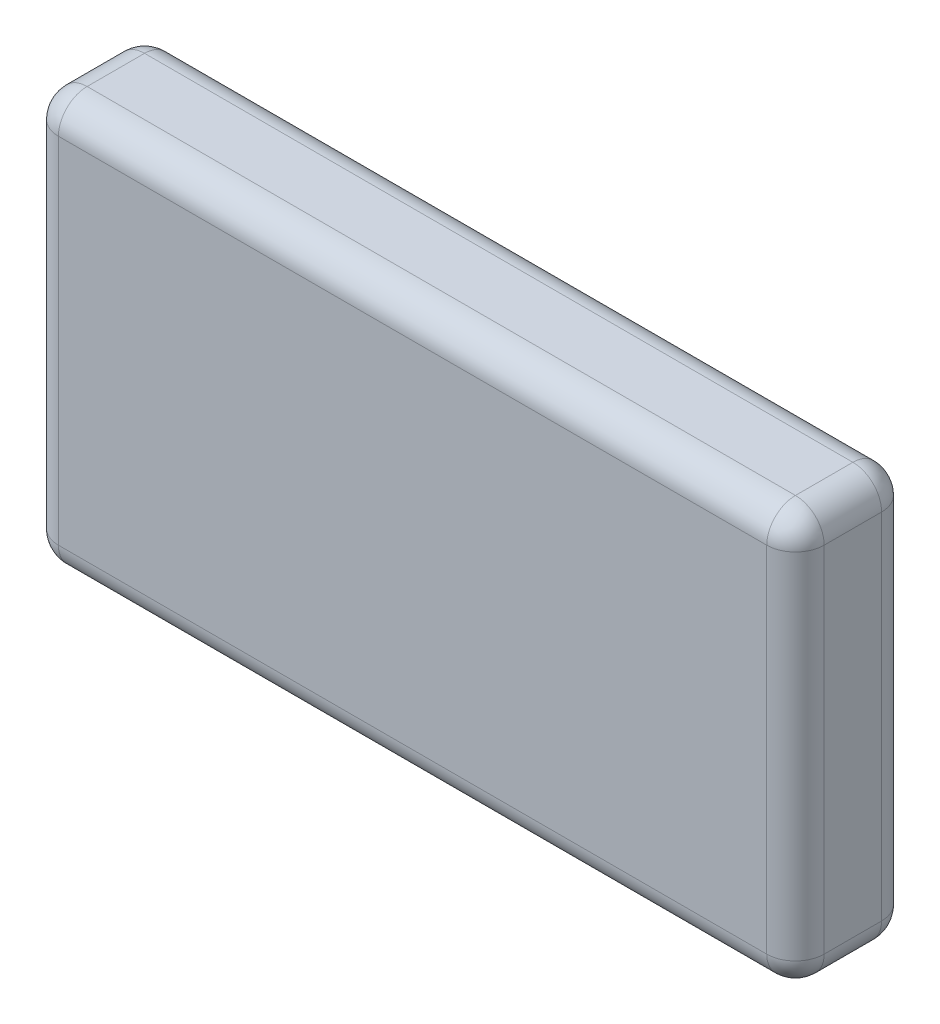
ISO-10303-21;
HEADER;
FILE_DESCRIPTION(('STEP AP214'),'2;1');
FILE_NAME('part.step','',(''),(''),'','','');
FILE_SCHEMA(('AUTOMOTIVE_DESIGN { 1 0 10303 214 1 1 1 1 }'));
ENDSEC;
DATA;
#1=APPLICATION_CONTEXT('core data for automotive mechanical design processes');
#2=APPLICATION_PROTOCOL_DEFINITION('international standard','automotive_design',2000,#1);
#3=PRODUCT_CONTEXT('',#1,'mechanical');
#4=PRODUCT('Part','Part','',(#3));
#5=PRODUCT_RELATED_PRODUCT_CATEGORY('part','',(#4));
#6=PRODUCT_DEFINITION_FORMATION('','',#4);
#7=PRODUCT_DEFINITION_CONTEXT('part definition',#1,'design');
#8=PRODUCT_DEFINITION('design','',#6,#7);
#9=PRODUCT_DEFINITION_SHAPE('','',#8);
#10=(LENGTH_UNIT() NAMED_UNIT(*) SI_UNIT(.MILLI.,.METRE.));
#11=(NAMED_UNIT(*) PLANE_ANGLE_UNIT() SI_UNIT($,.RADIAN.));
#12=(NAMED_UNIT(*) SI_UNIT($,.STERADIAN.) SOLID_ANGLE_UNIT());
#13=UNCERTAINTY_MEASURE_WITH_UNIT(LENGTH_MEASURE(1.E-05),#10,'distance_accuracy_value','');
#14=(GEOMETRIC_REPRESENTATION_CONTEXT(3) GLOBAL_UNCERTAINTY_ASSIGNED_CONTEXT((#13)) GLOBAL_UNIT_ASSIGNED_CONTEXT((#10,
#11,#12)) REPRESENTATION_CONTEXT('',''));
#15=CARTESIAN_POINT('',(0.,0.,0.));
#16=DIRECTION('',(0.,0.,1.));
#17=DIRECTION('',(1.,0.,0.));
#18=AXIS2_PLACEMENT_3D('',#15,#16,#17);
#19=CARTESIAN_POINT('',(-1000.,-537.5,300.));
#20=DIRECTION('',(1.,0.,0.));
#21=DIRECTION('',(0.,0.,-1.));
#22=AXIS2_PLACEMENT_3D('',#19,#20,#21);
#23=PLANE('',#22);
#24=DIRECTION('',(0.,-1.,0.));
#25=VECTOR('',#24,1.);
#26=CARTESIAN_POINT('',(-1000.,-537.5,75.));
#27=LINE('',#26,#25);
#28=CARTESIAN_POINT('',(-1000.,462.5,75.));
#29=VERTEX_POINT('',#28);
#30=CARTESIAN_POINT('',(-1000.,-462.5,75.));
#31=VERTEX_POINT('',#30);
#32=EDGE_CURVE('E159',#29,#31,#27,.T.);
#33=ORIENTED_EDGE('',*,*,#32,.T.);
#34=DIRECTION('',(0.,0.,-1.));
#35=VECTOR('',#34,1.);
#36=CARTESIAN_POINT('',(-1000.,-462.5,300.));
#37=LINE('',#36,#35);
#38=CARTESIAN_POINT('',(-1000.,-462.5,225.));
#39=VERTEX_POINT('',#38);
#40=EDGE_CURVE('E129',#31,#39,#37,.F.);
#41=ORIENTED_EDGE('',*,*,#40,.T.);
#42=DIRECTION('',(0.,-1.,0.));
#43=VECTOR('',#42,1.);
#44=CARTESIAN_POINT('',(-1000.,537.5,225.));
#45=LINE('',#44,#43);
#46=CARTESIAN_POINT('',(-1000.,462.5,225.));
#47=VERTEX_POINT('',#46);
#48=EDGE_CURVE('E165',#39,#47,#45,.F.);
#49=ORIENTED_EDGE('',*,*,#48,.T.);
#50=DIRECTION('',(0.,0.,-1.));
#51=VECTOR('',#50,1.);
#52=CARTESIAN_POINT('',(-1000.,462.5,300.));
#53=LINE('',#52,#51);
#54=EDGE_CURVE('E157',#47,#29,#53,.T.);
#55=ORIENTED_EDGE('',*,*,#54,.T.);
#56=EDGE_LOOP('',(#33,#41,#49,#55));
#57=FACE_BOUND('',#56,.T.);
#58=ADVANCED_FACE('F33',(#57),#23,.F.);
#59=CARTESIAN_POINT('',(1000.,-537.5,300.));
#60=DIRECTION('',(0.,1.,0.));
#61=DIRECTION('',(-1.,0.,0.));
#62=AXIS2_PLACEMENT_3D('',#59,#60,#61);
#63=PLANE('',#62);
#64=DIRECTION('',(1.,0.,0.));
#65=VECTOR('',#64,1.);
#66=CARTESIAN_POINT('',(-1000.,-537.5,225.));
#67=LINE('',#66,#65);
#68=CARTESIAN_POINT('',(925.,-537.5,225.));
#69=VERTEX_POINT('',#68);
#70=CARTESIAN_POINT('',(-925.,-537.5,225.));
#71=VERTEX_POINT('',#70);
#72=EDGE_CURVE('E155',#69,#71,#67,.F.);
#73=ORIENTED_EDGE('',*,*,#72,.T.);
#74=DIRECTION('',(0.,0.,-1.));
#75=VECTOR('',#74,1.);
#76=CARTESIAN_POINT('',(-925.,-537.5,300.));
#77=LINE('',#76,#75);
#78=CARTESIAN_POINT('',(-925.,-537.5,75.));
#79=VERTEX_POINT('',#78);
#80=EDGE_CURVE('E127',#71,#79,#77,.T.);
#81=ORIENTED_EDGE('',*,*,#80,.T.);
#82=DIRECTION('',(1.,0.,0.));
#83=VECTOR('',#82,1.);
#84=CARTESIAN_POINT('',(1000.,-537.5,75.));
#85=LINE('',#84,#83);
#86=CARTESIAN_POINT('',(925.,-537.5,75.));
#87=VERTEX_POINT('',#86);
#88=EDGE_CURVE('E145',#79,#87,#85,.T.);
#89=ORIENTED_EDGE('',*,*,#88,.T.);
#90=DIRECTION('',(0.,0.,-1.));
#91=VECTOR('',#90,1.);
#92=CARTESIAN_POINT('',(925.,-537.5,300.));
#93=LINE('',#92,#91);
#94=EDGE_CURVE('E151',#87,#69,#93,.F.);
#95=ORIENTED_EDGE('',*,*,#94,.T.);
#96=EDGE_LOOP('',(#73,#81,#89,#95));
#97=FACE_BOUND('',#96,.T.);
#98=ADVANCED_FACE('F153',(#97),#63,.F.);
#99=CARTESIAN_POINT('',(1000.,-537.5,300.));
#100=DIRECTION('',(-1.,0.,0.));
#101=DIRECTION('',(0.,0.,1.));
#102=AXIS2_PLACEMENT_3D('',#99,#100,#101);
#103=PLANE('',#102);
#104=DIRECTION('',(0.,1.,0.));
#105=VECTOR('',#104,1.);
#106=CARTESIAN_POINT('',(1000.,-537.5,225.));
#107=LINE('',#106,#105);
#108=CARTESIAN_POINT('',(1000.,462.5,225.));
#109=VERTEX_POINT('',#108);
#110=CARTESIAN_POINT('',(1000.,-462.5,225.));
#111=VERTEX_POINT('',#110);
#112=EDGE_CURVE('E177',#109,#111,#107,.F.);
#113=ORIENTED_EDGE('',*,*,#112,.T.);
#114=DIRECTION('',(0.,0.,-1.));
#115=VECTOR('',#114,1.);
#116=CARTESIAN_POINT('',(1000.,-462.5,300.));
#117=LINE('',#116,#115);
#118=CARTESIAN_POINT('',(1000.,-462.5,75.));
#119=VERTEX_POINT('',#118);
#120=EDGE_CURVE('E183',#111,#119,#117,.T.);
#121=ORIENTED_EDGE('',*,*,#120,.T.);
#122=DIRECTION('',(0.,1.,0.));
#123=VECTOR('',#122,1.);
#124=CARTESIAN_POINT('',(1000.,-537.5,75.));
#125=LINE('',#124,#123);
#126=CARTESIAN_POINT('',(1000.,462.5,75.));
#127=VERTEX_POINT('',#126);
#128=EDGE_CURVE('E181',#119,#127,#125,.T.);
#129=ORIENTED_EDGE('',*,*,#128,.T.);
#130=DIRECTION('',(0.,0.,-1.));
#131=VECTOR('',#130,1.);
#132=CARTESIAN_POINT('',(1000.,462.5,300.));
#133=LINE('',#132,#131);
#134=EDGE_CURVE('E179',#127,#109,#133,.F.);
#135=ORIENTED_EDGE('',*,*,#134,.T.);
#136=EDGE_LOOP('',(#113,#121,#129,#135));
#137=FACE_BOUND('',#136,.T.);
#138=ADVANCED_FACE('F281',(#137),#103,.F.);
#139=CARTESIAN_POINT('',(1000.,537.5,300.));
#140=DIRECTION('',(0.,-1.,0.));
#141=DIRECTION('',(1.,0.,0.));
#142=AXIS2_PLACEMENT_3D('',#139,#140,#141);
#143=PLANE('',#142);
#144=DIRECTION('',(-1.,0.,0.));
#145=VECTOR('',#144,1.);
#146=CARTESIAN_POINT('',(1000.,537.5,225.));
#147=LINE('',#146,#145);
#148=CARTESIAN_POINT('',(-925.,537.5,225.));
#149=VERTEX_POINT('',#148);
#150=CARTESIAN_POINT('',(925.,537.5,225.));
#151=VERTEX_POINT('',#150);
#152=EDGE_CURVE('E195',#149,#151,#147,.F.);
#153=ORIENTED_EDGE('',*,*,#152,.T.);
#154=DIRECTION('',(0.,0.,-1.));
#155=VECTOR('',#154,1.);
#156=CARTESIAN_POINT('',(925.,537.5,300.));
#157=LINE('',#156,#155);
#158=CARTESIAN_POINT('',(925.,537.5,75.));
#159=VERTEX_POINT('',#158);
#160=EDGE_CURVE('E11',#151,#159,#157,.T.);
#161=ORIENTED_EDGE('',*,*,#160,.T.);
#162=DIRECTION('',(-1.,0.,0.));
#163=VECTOR('',#162,1.);
#164=CARTESIAN_POINT('',(1000.,537.5,75.));
#165=LINE('',#164,#163);
#166=CARTESIAN_POINT('',(-925.,537.5,75.));
#167=VERTEX_POINT('',#166);
#168=EDGE_CURVE('E42',#159,#167,#165,.T.);
#169=ORIENTED_EDGE('',*,*,#168,.T.);
#170=DIRECTION('',(0.,0.,-1.));
#171=VECTOR('',#170,1.);
#172=CARTESIAN_POINT('',(-925.,537.5,300.));
#173=LINE('',#172,#171);
#174=EDGE_CURVE('E197',#167,#149,#173,.F.);
#175=ORIENTED_EDGE('',*,*,#174,.T.);
#176=EDGE_LOOP('',(#153,#161,#169,#175));
#177=FACE_BOUND('',#176,.T.);
#178=ADVANCED_FACE('F293',(#177),#143,.F.);
#179=CARTESIAN_POINT('',(0.,0.,300.));
#180=DIRECTION('',(0.,0.,1.));
#181=DIRECTION('',(1.,0.,0.));
#182=AXIS2_PLACEMENT_3D('',#179,#180,#181);
#183=PLANE('',#182);
#184=DIRECTION('',(0.,-1.,0.));
#185=VECTOR('',#184,1.);
#186=CARTESIAN_POINT('',(-925.,-537.5,300.));
#187=LINE('',#186,#185);
#188=CARTESIAN_POINT('',(-925.,462.5,300.));
#189=VERTEX_POINT('',#188);
#190=CARTESIAN_POINT('',(-925.,-462.5,300.));
#191=VERTEX_POINT('',#190);
#192=EDGE_CURVE('E172',#189,#191,#187,.T.);
#193=ORIENTED_EDGE('',*,*,#192,.T.);
#194=DIRECTION('',(1.,0.,0.));
#195=VECTOR('',#194,1.);
#196=CARTESIAN_POINT('',(1000.,-462.5,300.));
#197=LINE('',#196,#195);
#198=CARTESIAN_POINT('',(925.,-462.5,300.));
#199=VERTEX_POINT('',#198);
#200=EDGE_CURVE('E174',#191,#199,#197,.T.);
#201=ORIENTED_EDGE('',*,*,#200,.T.);
#202=DIRECTION('',(0.,1.,0.));
#203=VECTOR('',#202,1.);
#204=CARTESIAN_POINT('',(925.,537.5,300.));
#205=LINE('',#204,#203);
#206=CARTESIAN_POINT('',(925.,462.5,300.));
#207=VERTEX_POINT('',#206);
#208=EDGE_CURVE('E170',#199,#207,#205,.T.);
#209=ORIENTED_EDGE('',*,*,#208,.T.);
#210=DIRECTION('',(-1.,0.,0.));
#211=VECTOR('',#210,1.);
#212=CARTESIAN_POINT('',(-1000.,462.5,300.));
#213=LINE('',#212,#211);
#214=EDGE_CURVE('E168',#207,#189,#213,.T.);
#215=ORIENTED_EDGE('',*,*,#214,.T.);
#216=EDGE_LOOP('',(#193,#201,#209,#215));
#217=FACE_BOUND('',#216,.T.);
#218=ADVANCED_FACE('F272',(#217),#183,.T.);
#219=CARTESIAN_POINT('',(0.,0.,0.));
#220=DIRECTION('',(0.,0.,1.));
#221=DIRECTION('',(1.,0.,0.));
#222=AXIS2_PLACEMENT_3D('',#219,#220,#221);
#223=PLANE('',#222);
#224=DIRECTION('',(0.,1.,0.));
#225=VECTOR('',#224,1.);
#226=CARTESIAN_POINT('',(925.,0.,0.));
#227=LINE('',#226,#225);
#228=CARTESIAN_POINT('',(925.,462.5,0.));
#229=VERTEX_POINT('',#228);
#230=CARTESIAN_POINT('',(925.,-462.5,0.));
#231=VERTEX_POINT('',#230);
#232=EDGE_CURVE('E188',#229,#231,#227,.F.);
#233=ORIENTED_EDGE('',*,*,#232,.T.);
#234=DIRECTION('',(1.,0.,0.));
#235=VECTOR('',#234,1.);
#236=CARTESIAN_POINT('',(0.,-462.5,0.));
#237=LINE('',#236,#235);
#238=CARTESIAN_POINT('',(-925.,-462.5,0.));
#239=VERTEX_POINT('',#238);
#240=EDGE_CURVE('E192',#231,#239,#237,.F.);
#241=ORIENTED_EDGE('',*,*,#240,.T.);
#242=DIRECTION('',(0.,-1.,0.));
#243=VECTOR('',#242,1.);
#244=CARTESIAN_POINT('',(-925.,0.,0.));
#245=LINE('',#244,#243);
#246=CARTESIAN_POINT('',(-925.,462.5,0.));
#247=VERTEX_POINT('',#246);
#248=EDGE_CURVE('E190',#239,#247,#245,.F.);
#249=ORIENTED_EDGE('',*,*,#248,.T.);
#250=DIRECTION('',(-1.,0.,0.));
#251=VECTOR('',#250,1.);
#252=CARTESIAN_POINT('',(0.,462.5,0.));
#253=LINE('',#252,#251);
#254=EDGE_CURVE('E186',#247,#229,#253,.F.);
#255=ORIENTED_EDGE('',*,*,#254,.T.);
#256=EDGE_LOOP('',(#233,#241,#249,#255));
#257=FACE_BOUND('',#256,.T.);
#258=ADVANCED_FACE('F477',(#257),#223,.F.);
#259=CARTESIAN_POINT('',(925.,462.5,300.));
#260=DIRECTION('',(0.,0.,-1.));
#261=DIRECTION('',(-1.,0.,0.));
#262=AXIS2_PLACEMENT_3D('',#259,#260,#261);
#263=CYLINDRICAL_SURFACE('',#262,75.);
#264=CARTESIAN_POINT('',(925.,462.5,225.));
#265=DIRECTION('',(0.,0.,1.));
#266=DIRECTION('',(1.,0.,0.));
#267=AXIS2_PLACEMENT_3D('',#264,#265,#266);
#268=CIRCLE('',#267,75.);
#269=EDGE_CURVE('E37',#109,#151,#268,.T.);
#270=ORIENTED_EDGE('',*,*,#269,.F.);
#271=ORIENTED_EDGE('',*,*,#134,.F.);
#272=CARTESIAN_POINT('',(925.,462.5,75.));
#273=DIRECTION('',(0.,0.,-1.));
#274=DIRECTION('',(-1.,0.,0.));
#275=AXIS2_PLACEMENT_3D('',#272,#273,#274);
#276=CIRCLE('',#275,75.);
#277=EDGE_CURVE('E249',#159,#127,#276,.T.);
#278=ORIENTED_EDGE('',*,*,#277,.F.);
#279=ORIENTED_EDGE('',*,*,#160,.F.);
#280=EDGE_LOOP('',(#270,#271,#278,#279));
#281=FACE_BOUND('',#280,.T.);
#282=ADVANCED_FACE('F35',(#281),#263,.T.);
#283=CARTESIAN_POINT('',(925.,462.5,225.));
#284=DIRECTION('',(0.,0.,1.));
#285=DIRECTION('',(1.,0.,0.));
#286=AXIS2_PLACEMENT_3D('',#283,#284,#285);
#287=SPHERICAL_SURFACE('',#286,75.);
#288=CARTESIAN_POINT('',(925.,462.5,225.));
#289=DIRECTION('',(0.,1.,0.));
#290=DIRECTION('',(0.,0.,1.));
#291=AXIS2_PLACEMENT_3D('',#288,#289,#290);
#292=CIRCLE('',#291,75.);
#293=EDGE_CURVE('E244',#109,#207,#292,.F.);
#294=ORIENTED_EDGE('',*,*,#293,.F.);
#295=ORIENTED_EDGE('',*,*,#269,.T.);
#296=CARTESIAN_POINT('',(925.,462.5,225.));
#297=DIRECTION('',(1.,0.,0.));
#298=DIRECTION('',(0.,0.,-1.));
#299=AXIS2_PLACEMENT_3D('',#296,#297,#298);
#300=CIRCLE('',#299,75.);
#301=EDGE_CURVE('E247',#207,#151,#300,.F.);
#302=ORIENTED_EDGE('',*,*,#301,.F.);
#303=EDGE_LOOP('',(#294,#295,#302));
#304=FACE_BOUND('',#303,.T.);
#305=ADVANCED_FACE('F259',(#304),#287,.T.);
#306=CARTESIAN_POINT('',(925.,462.5,75.));
#307=DIRECTION('',(0.,0.,1.));
#308=DIRECTION('',(1.,0.,0.));
#309=AXIS2_PLACEMENT_3D('',#306,#307,#308);
#310=SPHERICAL_SURFACE('',#309,75.);
#311=CARTESIAN_POINT('',(925.,462.5,75.));
#312=DIRECTION('',(1.,0.,0.));
#313=DIRECTION('',(0.,0.,-1.));
#314=AXIS2_PLACEMENT_3D('',#311,#312,#313);
#315=CIRCLE('',#314,75.);
#316=EDGE_CURVE('E239',#159,#229,#315,.F.);
#317=ORIENTED_EDGE('',*,*,#316,.F.);
#318=ORIENTED_EDGE('',*,*,#277,.T.);
#319=CARTESIAN_POINT('',(925.,462.5,75.));
#320=DIRECTION('',(0.,1.,0.));
#321=DIRECTION('',(0.,0.,1.));
#322=AXIS2_PLACEMENT_3D('',#319,#320,#321);
#323=CIRCLE('',#322,75.);
#324=EDGE_CURVE('E241',#229,#127,#323,.F.);
#325=ORIENTED_EDGE('',*,*,#324,.F.);
#326=EDGE_LOOP('',(#317,#318,#325));
#327=FACE_BOUND('',#326,.T.);
#328=ADVANCED_FACE('F456',(#327),#310,.T.);
#329=CARTESIAN_POINT('',(0.,462.5,225.));
#330=DIRECTION('',(1.,0.,0.));
#331=DIRECTION('',(0.,1.,0.));
#332=AXIS2_PLACEMENT_3D('',#329,#330,#331);
#333=CYLINDRICAL_SURFACE('',#332,75.);
#334=ORIENTED_EDGE('',*,*,#301,.T.);
#335=ORIENTED_EDGE('',*,*,#152,.F.);
#336=CARTESIAN_POINT('',(-925.,462.5,225.));
#337=DIRECTION('',(-1.,0.,0.));
#338=DIRECTION('',(0.,0.,1.));
#339=AXIS2_PLACEMENT_3D('',#336,#337,#338);
#340=CIRCLE('',#339,75.);
#341=EDGE_CURVE('E233',#189,#149,#340,.T.);
#342=ORIENTED_EDGE('',*,*,#341,.F.);
#343=ORIENTED_EDGE('',*,*,#214,.F.);
#344=EDGE_LOOP('',(#334,#335,#342,#343));
#345=FACE_BOUND('',#344,.T.);
#346=ADVANCED_FACE('F267',(#345),#333,.T.);
#347=CARTESIAN_POINT('',(925.,0.,225.));
#348=DIRECTION('',(0.,-1.,0.));
#349=DIRECTION('',(0.,0.,-1.));
#350=AXIS2_PLACEMENT_3D('',#347,#348,#349);
#351=CYLINDRICAL_SURFACE('',#350,75.);
#352=ORIENTED_EDGE('',*,*,#293,.T.);
#353=ORIENTED_EDGE('',*,*,#208,.F.);
#354=CARTESIAN_POINT('',(925.,-462.5,225.));
#355=DIRECTION('',(0.,-1.,0.));
#356=DIRECTION('',(0.,0.,-1.));
#357=AXIS2_PLACEMENT_3D('',#354,#355,#356);
#358=CIRCLE('',#357,75.);
#359=EDGE_CURVE('E230',#111,#199,#358,.T.);
#360=ORIENTED_EDGE('',*,*,#359,.F.);
#361=ORIENTED_EDGE('',*,*,#112,.F.);
#362=EDGE_LOOP('',(#352,#353,#360,#361));
#363=FACE_BOUND('',#362,.T.);
#364=ADVANCED_FACE('F278',(#363),#351,.T.);
#365=CARTESIAN_POINT('',(925.,-462.5,300.));
#366=DIRECTION('',(0.,0.,-1.));
#367=DIRECTION('',(-1.,0.,0.));
#368=AXIS2_PLACEMENT_3D('',#365,#366,#367);
#369=CYLINDRICAL_SURFACE('',#368,75.);
#370=CARTESIAN_POINT('',(925.,-462.5,75.));
#371=DIRECTION('',(0.,0.,-1.));
#372=DIRECTION('',(-1.,0.,0.));
#373=AXIS2_PLACEMENT_3D('',#370,#371,#372);
#374=CIRCLE('',#373,75.);
#375=EDGE_CURVE('E224',#119,#87,#374,.T.);
#376=ORIENTED_EDGE('',*,*,#375,.F.);
#377=ORIENTED_EDGE('',*,*,#120,.F.);
#378=CARTESIAN_POINT('',(925.,-462.5,225.));
#379=DIRECTION('',(0.,0.,1.));
#380=DIRECTION('',(1.,0.,0.));
#381=AXIS2_PLACEMENT_3D('',#378,#379,#380);
#382=CIRCLE('',#381,75.);
#383=EDGE_CURVE('E227',#69,#111,#382,.T.);
#384=ORIENTED_EDGE('',*,*,#383,.F.);
#385=ORIENTED_EDGE('',*,*,#94,.F.);
#386=EDGE_LOOP('',(#376,#377,#384,#385));
#387=FACE_BOUND('',#386,.T.);
#388=ADVANCED_FACE('F285',(#387),#369,.T.);
#389=CARTESIAN_POINT('',(925.,-537.5,75.));
#390=DIRECTION('',(0.,1.,0.));
#391=DIRECTION('',(0.,0.,1.));
#392=AXIS2_PLACEMENT_3D('',#389,#390,#391);
#393=CYLINDRICAL_SURFACE('',#392,75.);
#394=ORIENTED_EDGE('',*,*,#324,.T.);
#395=ORIENTED_EDGE('',*,*,#128,.F.);
#396=CARTESIAN_POINT('',(925.,-462.5,75.));
#397=DIRECTION('',(0.,-1.,0.));
#398=DIRECTION('',(0.,0.,-1.));
#399=AXIS2_PLACEMENT_3D('',#396,#397,#398);
#400=CIRCLE('',#399,75.);
#401=EDGE_CURVE('E222',#231,#119,#400,.T.);
#402=ORIENTED_EDGE('',*,*,#401,.F.);
#403=ORIENTED_EDGE('',*,*,#232,.F.);
#404=EDGE_LOOP('',(#394,#395,#402,#403));
#405=FACE_BOUND('',#404,.T.);
#406=ADVANCED_FACE('F291',(#405),#393,.T.);
#407=CARTESIAN_POINT('',(1000.,462.5,75.));
#408=DIRECTION('',(-1.,0.,0.));
#409=DIRECTION('',(0.,-1.,0.));
#410=AXIS2_PLACEMENT_3D('',#407,#408,#409);
#411=CYLINDRICAL_SURFACE('',#410,75.);
#412=ORIENTED_EDGE('',*,*,#316,.T.);
#413=ORIENTED_EDGE('',*,*,#254,.F.);
#414=CARTESIAN_POINT('',(-925.,462.5,75.));
#415=DIRECTION('',(-1.,0.,0.));
#416=DIRECTION('',(0.,0.,1.));
#417=AXIS2_PLACEMENT_3D('',#414,#415,#416);
#418=CIRCLE('',#417,75.);
#419=EDGE_CURVE('E219',#167,#247,#418,.T.);
#420=ORIENTED_EDGE('',*,*,#419,.F.);
#421=ORIENTED_EDGE('',*,*,#168,.F.);
#422=EDGE_LOOP('',(#412,#413,#420,#421));
#423=FACE_BOUND('',#422,.T.);
#424=ADVANCED_FACE('F300',(#423),#411,.T.);
#425=CARTESIAN_POINT('',(-925.,462.5,300.));
#426=DIRECTION('',(0.,0.,-1.));
#427=DIRECTION('',(-1.,0.,0.));
#428=AXIS2_PLACEMENT_3D('',#425,#426,#427);
#429=CYLINDRICAL_SURFACE('',#428,75.);
#430=CARTESIAN_POINT('',(-925.,462.5,225.));
#431=DIRECTION('',(0.,0.,1.));
#432=DIRECTION('',(1.,0.,0.));
#433=AXIS2_PLACEMENT_3D('',#430,#431,#432);
#434=CIRCLE('',#433,75.);
#435=EDGE_CURVE('E236',#149,#47,#434,.T.);
#436=ORIENTED_EDGE('',*,*,#435,.F.);
#437=ORIENTED_EDGE('',*,*,#174,.F.);
#438=CARTESIAN_POINT('',(-925.,462.5,75.));
#439=DIRECTION('',(0.,0.,-1.));
#440=DIRECTION('',(-1.,0.,0.));
#441=AXIS2_PLACEMENT_3D('',#438,#439,#440);
#442=CIRCLE('',#441,75.);
#443=EDGE_CURVE('E216',#29,#167,#442,.T.);
#444=ORIENTED_EDGE('',*,*,#443,.F.);
#445=ORIENTED_EDGE('',*,*,#54,.F.);
#446=EDGE_LOOP('',(#436,#437,#444,#445));
#447=FACE_BOUND('',#446,.T.);
#448=ADVANCED_FACE('F296',(#447),#429,.T.);
#449=CARTESIAN_POINT('',(-925.,462.5,225.));
#450=DIRECTION('',(0.,0.,1.));
#451=DIRECTION('',(1.,0.,0.));
#452=AXIS2_PLACEMENT_3D('',#449,#450,#451);
#453=SPHERICAL_SURFACE('',#452,75.);
#454=ORIENTED_EDGE('',*,*,#341,.T.);
#455=ORIENTED_EDGE('',*,*,#435,.T.);
#456=CARTESIAN_POINT('',(-925.,462.5,225.));
#457=DIRECTION('',(0.,1.,0.));
#458=DIRECTION('',(0.,0.,1.));
#459=AXIS2_PLACEMENT_3D('',#456,#457,#458);
#460=CIRCLE('',#459,75.);
#461=EDGE_CURVE('E213',#189,#47,#460,.F.);
#462=ORIENTED_EDGE('',*,*,#461,.F.);
#463=EDGE_LOOP('',(#454,#455,#462));
#464=FACE_BOUND('',#463,.T.);
#465=ADVANCED_FACE('F309',(#464),#453,.T.);
#466=CARTESIAN_POINT('',(925.,-462.5,225.));
#467=DIRECTION('',(0.,0.,1.));
#468=DIRECTION('',(1.,0.,0.));
#469=AXIS2_PLACEMENT_3D('',#466,#467,#468);
#470=SPHERICAL_SURFACE('',#469,75.);
#471=ORIENTED_EDGE('',*,*,#383,.T.);
#472=ORIENTED_EDGE('',*,*,#359,.T.);
#473=CARTESIAN_POINT('',(925.,-462.5,225.));
#474=DIRECTION('',(1.,0.,0.));
#475=DIRECTION('',(0.,0.,-1.));
#476=AXIS2_PLACEMENT_3D('',#473,#474,#475);
#477=CIRCLE('',#476,75.);
#478=EDGE_CURVE('E211',#69,#199,#477,.F.);
#479=ORIENTED_EDGE('',*,*,#478,.F.);
#480=EDGE_LOOP('',(#471,#472,#479));
#481=FACE_BOUND('',#480,.T.);
#482=ADVANCED_FACE('F319',(#481),#470,.T.);
#483=CARTESIAN_POINT('',(925.,-462.5,75.));
#484=DIRECTION('',(0.,0.,1.));
#485=DIRECTION('',(1.,0.,0.));
#486=AXIS2_PLACEMENT_3D('',#483,#484,#485);
#487=SPHERICAL_SURFACE('',#486,75.);
#488=ORIENTED_EDGE('',*,*,#401,.T.);
#489=ORIENTED_EDGE('',*,*,#375,.T.);
#490=CARTESIAN_POINT('',(925.,-462.5,75.));
#491=DIRECTION('',(1.,0.,0.));
#492=DIRECTION('',(0.,0.,-1.));
#493=AXIS2_PLACEMENT_3D('',#490,#491,#492);
#494=CIRCLE('',#493,75.);
#495=EDGE_CURVE('E148',#231,#87,#494,.F.);
#496=ORIENTED_EDGE('',*,*,#495,.F.);
#497=EDGE_LOOP('',(#488,#489,#496));
#498=FACE_BOUND('',#497,.T.);
#499=ADVANCED_FACE('F321',(#498),#487,.T.);
#500=CARTESIAN_POINT('',(-925.,462.5,75.));
#501=DIRECTION('',(0.,0.,1.));
#502=DIRECTION('',(1.,0.,0.));
#503=AXIS2_PLACEMENT_3D('',#500,#501,#502);
#504=SPHERICAL_SURFACE('',#503,75.);
#505=ORIENTED_EDGE('',*,*,#443,.T.);
#506=ORIENTED_EDGE('',*,*,#419,.T.);
#507=CARTESIAN_POINT('',(-925.,462.5,75.));
#508=DIRECTION('',(0.,1.,0.));
#509=DIRECTION('',(-1.,0.,0.));
#510=AXIS2_PLACEMENT_3D('',#507,#508,#509);
#511=CIRCLE('',#510,75.);
#512=EDGE_CURVE('E207',#29,#247,#511,.F.);
#513=ORIENTED_EDGE('',*,*,#512,.F.);
#514=EDGE_LOOP('',(#505,#506,#513));
#515=FACE_BOUND('',#514,.T.);
#516=ADVANCED_FACE('F302',(#515),#504,.T.);
#517=CARTESIAN_POINT('',(-925.,0.,225.));
#518=DIRECTION('',(0.,1.,0.));
#519=DIRECTION('',(0.,0.,1.));
#520=AXIS2_PLACEMENT_3D('',#517,#518,#519);
#521=CYLINDRICAL_SURFACE('',#520,75.);
#522=ORIENTED_EDGE('',*,*,#461,.T.);
#523=ORIENTED_EDGE('',*,*,#48,.F.);
#524=CARTESIAN_POINT('',(-925.,-462.5,225.));
#525=DIRECTION('',(0.,-1.,0.));
#526=DIRECTION('',(0.,0.,-1.));
#527=AXIS2_PLACEMENT_3D('',#524,#525,#526);
#528=CIRCLE('',#527,75.);
#529=EDGE_CURVE('E204',#191,#39,#528,.T.);
#530=ORIENTED_EDGE('',*,*,#529,.F.);
#531=ORIENTED_EDGE('',*,*,#192,.F.);
#532=EDGE_LOOP('',(#522,#523,#530,#531));
#533=FACE_BOUND('',#532,.T.);
#534=ADVANCED_FACE('F311',(#533),#521,.T.);
#535=CARTESIAN_POINT('',(0.,-462.5,225.));
#536=DIRECTION('',(-1.,0.,0.));
#537=DIRECTION('',(0.,-1.,0.));
#538=AXIS2_PLACEMENT_3D('',#535,#536,#537);
#539=CYLINDRICAL_SURFACE('',#538,75.);
#540=ORIENTED_EDGE('',*,*,#478,.T.);
#541=ORIENTED_EDGE('',*,*,#200,.F.);
#542=CARTESIAN_POINT('',(-925.,-462.5,225.));
#543=DIRECTION('',(-1.,0.,0.));
#544=DIRECTION('',(0.,0.,1.));
#545=AXIS2_PLACEMENT_3D('',#542,#543,#544);
#546=CIRCLE('',#545,75.);
#547=EDGE_CURVE('E142',#71,#191,#546,.T.);
#548=ORIENTED_EDGE('',*,*,#547,.F.);
#549=ORIENTED_EDGE('',*,*,#72,.F.);
#550=EDGE_LOOP('',(#540,#541,#548,#549));
#551=FACE_BOUND('',#550,.T.);
#552=ADVANCED_FACE('F317',(#551),#539,.T.);
#553=CARTESIAN_POINT('',(1000.,-462.5,75.));
#554=DIRECTION('',(1.,0.,0.));
#555=DIRECTION('',(0.,1.,0.));
#556=AXIS2_PLACEMENT_3D('',#553,#554,#555);
#557=CYLINDRICAL_SURFACE('',#556,75.);
#558=ORIENTED_EDGE('',*,*,#495,.T.);
#559=ORIENTED_EDGE('',*,*,#88,.F.);
#560=CARTESIAN_POINT('',(-925.,-462.5,75.));
#561=DIRECTION('',(-1.,0.,0.));
#562=DIRECTION('',(0.,0.,1.));
#563=AXIS2_PLACEMENT_3D('',#560,#561,#562);
#564=CIRCLE('',#563,75.);
#565=EDGE_CURVE('E134',#239,#79,#564,.T.);
#566=ORIENTED_EDGE('',*,*,#565,.F.);
#567=ORIENTED_EDGE('',*,*,#240,.F.);
#568=EDGE_LOOP('',(#558,#559,#566,#567));
#569=FACE_BOUND('',#568,.T.);
#570=ADVANCED_FACE('F146',(#569),#557,.T.);
#571=CARTESIAN_POINT('',(-925.,-537.5,75.));
#572=DIRECTION('',(0.,-1.,0.));
#573=DIRECTION('',(0.,0.,-1.));
#574=AXIS2_PLACEMENT_3D('',#571,#572,#573);
#575=CYLINDRICAL_SURFACE('',#574,75.);
#576=ORIENTED_EDGE('',*,*,#512,.T.);
#577=ORIENTED_EDGE('',*,*,#248,.F.);
#578=CARTESIAN_POINT('',(-925.,-462.5,75.));
#579=DIRECTION('',(0.,-1.,0.));
#580=DIRECTION('',(0.,0.,-1.));
#581=AXIS2_PLACEMENT_3D('',#578,#579,#580);
#582=CIRCLE('',#581,75.);
#583=EDGE_CURVE('E138',#31,#239,#582,.T.);
#584=ORIENTED_EDGE('',*,*,#583,.F.);
#585=ORIENTED_EDGE('',*,*,#32,.F.);
#586=EDGE_LOOP('',(#576,#577,#584,#585));
#587=FACE_BOUND('',#586,.T.);
#588=ADVANCED_FACE('F305',(#587),#575,.T.);
#589=CARTESIAN_POINT('',(-925.,-462.5,225.));
#590=DIRECTION('',(0.,0.,1.));
#591=DIRECTION('',(1.,0.,0.));
#592=AXIS2_PLACEMENT_3D('',#589,#590,#591);
#593=SPHERICAL_SURFACE('',#592,75.);
#594=ORIENTED_EDGE('',*,*,#547,.T.);
#595=ORIENTED_EDGE('',*,*,#529,.T.);
#596=CARTESIAN_POINT('',(-925.,-462.5,225.));
#597=DIRECTION('',(0.,0.,1.));
#598=DIRECTION('',(1.,0.,0.));
#599=AXIS2_PLACEMENT_3D('',#596,#597,#598);
#600=CIRCLE('',#599,75.);
#601=EDGE_CURVE('E131',#71,#39,#600,.F.);
#602=ORIENTED_EDGE('',*,*,#601,.F.);
#603=EDGE_LOOP('',(#594,#595,#602));
#604=FACE_BOUND('',#603,.T.);
#605=ADVANCED_FACE('F315',(#604),#593,.T.);
#606=CARTESIAN_POINT('',(-925.,-462.5,75.));
#607=DIRECTION('',(0.,0.,1.));
#608=DIRECTION('',(1.,0.,0.));
#609=AXIS2_PLACEMENT_3D('',#606,#607,#608);
#610=SPHERICAL_SURFACE('',#609,75.);
#611=ORIENTED_EDGE('',*,*,#583,.T.);
#612=ORIENTED_EDGE('',*,*,#565,.T.);
#613=CARTESIAN_POINT('',(-925.,-462.5,75.));
#614=DIRECTION('',(0.,0.,-1.));
#615=DIRECTION('',(-1.,0.,0.));
#616=AXIS2_PLACEMENT_3D('',#613,#614,#615);
#617=CIRCLE('',#616,75.);
#618=EDGE_CURVE('E123',#31,#79,#617,.F.);
#619=ORIENTED_EDGE('',*,*,#618,.F.);
#620=EDGE_LOOP('',(#611,#612,#619));
#621=FACE_BOUND('',#620,.T.);
#622=ADVANCED_FACE('F136',(#621),#610,.T.);
#623=CARTESIAN_POINT('',(-925.,-462.5,300.));
#624=DIRECTION('',(0.,0.,-1.));
#625=DIRECTION('',(-1.,0.,0.));
#626=AXIS2_PLACEMENT_3D('',#623,#624,#625);
#627=CYLINDRICAL_SURFACE('',#626,75.);
#628=ORIENTED_EDGE('',*,*,#601,.T.);
#629=ORIENTED_EDGE('',*,*,#40,.F.);
#630=ORIENTED_EDGE('',*,*,#618,.T.);
#631=ORIENTED_EDGE('',*,*,#80,.F.);
#632=EDGE_LOOP('',(#628,#629,#630,#631));
#633=FACE_BOUND('',#632,.T.);
#634=ADVANCED_FACE('F125',(#633),#627,.T.);
#635=CLOSED_SHELL('',(#58,#98,#138,#178,#218,#258,#282,#305,#328,#346,#364,#388,#406,#424,#448,
#465,#482,#499,#516,#534,#552,#570,#588,#605,#622,#634));
#636=MANIFOLD_SOLID_BREP('B2',#635);
#637=ADVANCED_BREP_SHAPE_REPRESENTATION('',(#18,#636),#14);
#638=SHAPE_DEFINITION_REPRESENTATION(#9,#637);
ENDSEC;
END-ISO-10303-21;
